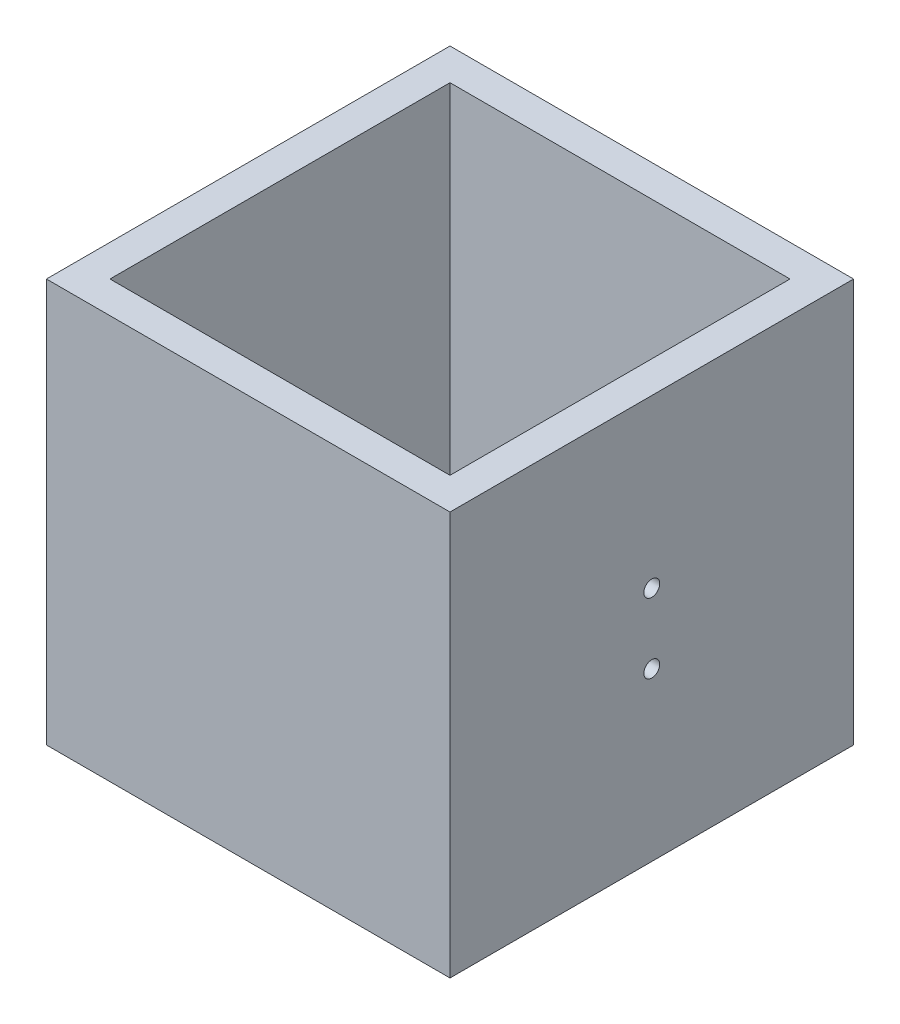
ISO-10303-21;
HEADER;
FILE_DESCRIPTION(('STEP AP214'),'2;1');
FILE_NAME('part.step','',(''),(''),'','','');
FILE_SCHEMA(('AUTOMOTIVE_DESIGN { 1 0 10303 214 1 1 1 1 }'));
ENDSEC;
DATA;
#1=APPLICATION_CONTEXT('core data for automotive mechanical design processes');
#2=APPLICATION_PROTOCOL_DEFINITION('international standard','automotive_design',2000,#1);
#3=PRODUCT_CONTEXT('',#1,'mechanical');
#4=PRODUCT('Part','Part','',(#3));
#5=PRODUCT_RELATED_PRODUCT_CATEGORY('part','',(#4));
#6=PRODUCT_DEFINITION_FORMATION('','',#4);
#7=PRODUCT_DEFINITION_CONTEXT('part definition',#1,'design');
#8=PRODUCT_DEFINITION('design','',#6,#7);
#9=PRODUCT_DEFINITION_SHAPE('','',#8);
#10=(LENGTH_UNIT() NAMED_UNIT(*) SI_UNIT(.MILLI.,.METRE.));
#11=(NAMED_UNIT(*) PLANE_ANGLE_UNIT() SI_UNIT($,.RADIAN.));
#12=(NAMED_UNIT(*) SI_UNIT($,.STERADIAN.) SOLID_ANGLE_UNIT());
#13=UNCERTAINTY_MEASURE_WITH_UNIT(LENGTH_MEASURE(1.E-05),#10,'distance_accuracy_value','');
#14=(GEOMETRIC_REPRESENTATION_CONTEXT(3) GLOBAL_UNCERTAINTY_ASSIGNED_CONTEXT((#13)) GLOBAL_UNIT_ASSIGNED_CONTEXT((#10,
#11,#12)) REPRESENTATION_CONTEXT('',''));
#15=CARTESIAN_POINT('',(0.,0.,0.));
#16=DIRECTION('',(0.,0.,1.));
#17=DIRECTION('',(1.,0.,0.));
#18=AXIS2_PLACEMENT_3D('',#15,#16,#17);
#19=CARTESIAN_POINT('',(-12.7,25.4,12.7));
#20=DIRECTION('',(1.,0.,0.));
#21=DIRECTION('',(0.,0.,-1.));
#22=AXIS2_PLACEMENT_3D('',#19,#20,#21);
#23=PLANE('',#22);
#24=DIRECTION('',(0.,0.,1.));
#25=VECTOR('',#24,1.);
#26=CARTESIAN_POINT('',(-12.7,0.,12.7));
#27=LINE('',#26,#25);
#28=CARTESIAN_POINT('',(-12.7,0.,-12.7));
#29=VERTEX_POINT('',#28);
#30=CARTESIAN_POINT('',(-12.7,0.,12.7));
#31=VERTEX_POINT('',#30);
#32=EDGE_CURVE('E206',#29,#31,#27,.T.);
#33=ORIENTED_EDGE('',*,*,#32,.T.);
#34=DIRECTION('',(0.,-1.,0.));
#35=VECTOR('',#34,1.);
#36=CARTESIAN_POINT('',(-12.7,25.4,12.7));
#37=LINE('',#36,#35);
#38=CARTESIAN_POINT('',(-12.7,25.4,12.7));
#39=VERTEX_POINT('',#38);
#40=EDGE_CURVE('E211',#39,#31,#37,.T.);
#41=ORIENTED_EDGE('',*,*,#40,.F.);
#42=DIRECTION('',(0.,0.,1.));
#43=VECTOR('',#42,1.);
#44=CARTESIAN_POINT('',(-12.7,25.4,12.7));
#45=LINE('',#44,#43);
#46=CARTESIAN_POINT('',(-12.7,25.4,-12.7));
#47=VERTEX_POINT('',#46);
#48=EDGE_CURVE('E197',#47,#39,#45,.T.);
#49=ORIENTED_EDGE('',*,*,#48,.F.);
#50=DIRECTION('',(0.,-1.,0.));
#51=VECTOR('',#50,1.);
#52=CARTESIAN_POINT('',(-12.7,25.4,-12.7));
#53=LINE('',#52,#51);
#54=EDGE_CURVE('E46',#47,#29,#53,.T.);
#55=ORIENTED_EDGE('',*,*,#54,.T.);
#56=EDGE_LOOP('',(#33,#41,#49,#55));
#57=FACE_BOUND('',#56,.T.);
#58=DIRECTION('',(0.,0.,1.));
#59=VECTOR('',#58,1.);
#60=CARTESIAN_POINT('',(-12.7,24.7,-12.));
#61=LINE('',#60,#59);
#62=CARTESIAN_POINT('',(-12.7,24.7,-12.));
#63=VERTEX_POINT('',#62);
#64=CARTESIAN_POINT('',(-12.7,24.7,12.));
#65=VERTEX_POINT('',#64);
#66=EDGE_CURVE('E54',#63,#65,#61,.T.);
#67=ORIENTED_EDGE('',*,*,#66,.T.);
#68=DIRECTION('',(0.,-1.,0.));
#69=VECTOR('',#68,1.);
#70=CARTESIAN_POINT('',(-12.7,24.7,12.));
#71=LINE('',#70,#69);
#72=CARTESIAN_POINT('',(-12.7,0.699999999999999,12.));
#73=VERTEX_POINT('',#72);
#74=EDGE_CURVE('E149',#65,#73,#71,.T.);
#75=ORIENTED_EDGE('',*,*,#74,.T.);
#76=DIRECTION('',(0.,0.,1.));
#77=VECTOR('',#76,1.);
#78=CARTESIAN_POINT('',(-12.7,0.699999999999999,-12.));
#79=LINE('',#78,#77);
#80=CARTESIAN_POINT('',(-12.7,0.699999999999999,-12.));
#81=VERTEX_POINT('',#80);
#82=EDGE_CURVE('E450',#81,#73,#79,.T.);
#83=ORIENTED_EDGE('',*,*,#82,.F.);
#84=DIRECTION('',(0.,-1.,0.));
#85=VECTOR('',#84,1.);
#86=CARTESIAN_POINT('',(-12.7,24.7,-12.));
#87=LINE('',#86,#85);
#88=EDGE_CURVE('E145',#63,#81,#87,.T.);
#89=ORIENTED_EDGE('',*,*,#88,.F.);
#90=EDGE_LOOP('',(#67,#75,#83,#89));
#91=FACE_BOUND('',#90,.T.);
#92=ADVANCED_FACE('F37',(#57,#91),#23,.F.);
#93=CARTESIAN_POINT('',(0.,25.4,0.));
#94=DIRECTION('',(0.,-1.,0.));
#95=DIRECTION('',(0.,0.,-1.));
#96=AXIS2_PLACEMENT_3D('',#93,#94,#95);
#97=PLANE('',#96);
#98=DIRECTION('',(0.,0.,-1.));
#99=VECTOR('',#98,1.);
#100=CARTESIAN_POINT('',(12.7,25.4,12.7));
#101=LINE('',#100,#99);
#102=CARTESIAN_POINT('',(12.7,25.4,12.7));
#103=VERTEX_POINT('',#102);
#104=CARTESIAN_POINT('',(12.7,25.4,-12.7));
#105=VERTEX_POINT('',#104);
#106=EDGE_CURVE('E191',#103,#105,#101,.T.);
#107=ORIENTED_EDGE('',*,*,#106,.T.);
#108=DIRECTION('',(-1.,0.,0.));
#109=VECTOR('',#108,1.);
#110=CARTESIAN_POINT('',(-12.7,25.4,-12.7));
#111=LINE('',#110,#109);
#112=EDGE_CURVE('E194',#105,#47,#111,.T.);
#113=ORIENTED_EDGE('',*,*,#112,.T.);
#114=ORIENTED_EDGE('',*,*,#48,.T.);
#115=DIRECTION('',(1.,0.,0.));
#116=VECTOR('',#115,1.);
#117=CARTESIAN_POINT('',(-12.7,25.4,12.7));
#118=LINE('',#117,#116);
#119=EDGE_CURVE('E199',#39,#103,#118,.T.);
#120=ORIENTED_EDGE('',*,*,#119,.T.);
#121=EDGE_LOOP('',(#107,#113,#114,#120));
#122=FACE_BOUND('',#121,.T.);
#123=DIRECTION('',(0.,0.,-1.));
#124=VECTOR('',#123,1.);
#125=CARTESIAN_POINT('',(10.7,25.4,0.));
#126=LINE('',#125,#124);
#127=CARTESIAN_POINT('',(10.7,25.4,10.7));
#128=VERTEX_POINT('',#127);
#129=CARTESIAN_POINT('',(10.7,25.4,-10.7));
#130=VERTEX_POINT('',#129);
#131=EDGE_CURVE('E184',#128,#130,#126,.T.);
#132=ORIENTED_EDGE('',*,*,#131,.F.);
#133=DIRECTION('',(1.,0.,0.));
#134=VECTOR('',#133,1.);
#135=CARTESIAN_POINT('',(0.,25.4,10.7));
#136=LINE('',#135,#134);
#137=CARTESIAN_POINT('',(-10.7,25.4,10.7));
#138=VERTEX_POINT('',#137);
#139=EDGE_CURVE('E175',#138,#128,#136,.T.);
#140=ORIENTED_EDGE('',*,*,#139,.F.);
#141=DIRECTION('',(0.,0.,1.));
#142=VECTOR('',#141,1.);
#143=CARTESIAN_POINT('',(-10.7,25.4,0.));
#144=LINE('',#143,#142);
#145=CARTESIAN_POINT('',(-10.7,25.4,-10.7));
#146=VERTEX_POINT('',#145);
#147=EDGE_CURVE('E188',#146,#138,#144,.T.);
#148=ORIENTED_EDGE('',*,*,#147,.F.);
#149=DIRECTION('',(-1.,0.,0.));
#150=VECTOR('',#149,1.);
#151=CARTESIAN_POINT('',(0.,25.4,-10.7));
#152=LINE('',#151,#150);
#153=EDGE_CURVE('E186',#130,#146,#152,.T.);
#154=ORIENTED_EDGE('',*,*,#153,.F.);
#155=EDGE_LOOP('',(#132,#140,#148,#154));
#156=FACE_BOUND('',#155,.T.);
#157=ADVANCED_FACE('F239',(#122,#156),#97,.F.);
#158=CARTESIAN_POINT('',(12.7,25.4,12.7));
#159=DIRECTION('',(-1.,0.,0.));
#160=DIRECTION('',(0.,0.,1.));
#161=AXIS2_PLACEMENT_3D('',#158,#159,#160);
#162=PLANE('',#161);
#163=CARTESIAN_POINT('',(12.7,14.9,0.));
#164=DIRECTION('',(1.,0.,0.));
#165=DIRECTION('',(0.,0.,-1.));
#166=AXIS2_PLACEMENT_3D('',#163,#164,#165);
#167=CIRCLE('',#166,0.5);
#168=CARTESIAN_POINT('',(12.7,14.9,-0.5));
#169=VERTEX_POINT('',#168);
#170=EDGE_CURVE('E150',#169,#169,#167,.T.);
#171=ORIENTED_EDGE('',*,*,#170,.F.);
#172=EDGE_LOOP('',(#171));
#173=FACE_BOUND('',#172,.T.);
#174=CARTESIAN_POINT('',(12.7,10.5,0.));
#175=DIRECTION('',(1.,0.,0.));
#176=DIRECTION('',(0.,0.,-1.));
#177=AXIS2_PLACEMENT_3D('',#174,#175,#176);
#178=CIRCLE('',#177,0.5);
#179=CARTESIAN_POINT('',(12.7,10.5,-0.5));
#180=VERTEX_POINT('',#179);
#181=EDGE_CURVE('E159',#180,#180,#178,.T.);
#182=ORIENTED_EDGE('',*,*,#181,.F.);
#183=EDGE_LOOP('',(#182));
#184=FACE_BOUND('',#183,.T.);
#185=DIRECTION('',(0.,0.,-1.));
#186=VECTOR('',#185,1.);
#187=CARTESIAN_POINT('',(12.7,0.,12.7));
#188=LINE('',#187,#186);
#189=CARTESIAN_POINT('',(12.7,0.,12.7));
#190=VERTEX_POINT('',#189);
#191=CARTESIAN_POINT('',(12.7,0.,-12.7));
#192=VERTEX_POINT('',#191);
#193=EDGE_CURVE('E170',#190,#192,#188,.T.);
#194=ORIENTED_EDGE('',*,*,#193,.T.);
#195=DIRECTION('',(0.,-1.,0.));
#196=VECTOR('',#195,1.);
#197=CARTESIAN_POINT('',(12.7,25.4,-12.7));
#198=LINE('',#197,#196);
#199=EDGE_CURVE('E11',#105,#192,#198,.T.);
#200=ORIENTED_EDGE('',*,*,#199,.F.);
#201=ORIENTED_EDGE('',*,*,#106,.F.);
#202=DIRECTION('',(0.,-1.,0.));
#203=VECTOR('',#202,1.);
#204=CARTESIAN_POINT('',(12.7,25.4,12.7));
#205=LINE('',#204,#203);
#206=EDGE_CURVE('E201',#103,#190,#205,.T.);
#207=ORIENTED_EDGE('',*,*,#206,.T.);
#208=EDGE_LOOP('',(#194,#200,#201,#207));
#209=FACE_BOUND('',#208,.T.);
#210=ADVANCED_FACE('F39',(#173,#184,#209),#162,.F.);
#211=CARTESIAN_POINT('',(-12.7,25.4,-12.7));
#212=DIRECTION('',(0.,0.,1.));
#213=DIRECTION('',(1.,0.,0.));
#214=AXIS2_PLACEMENT_3D('',#211,#212,#213);
#215=PLANE('',#214);
#216=DIRECTION('',(-1.,0.,0.));
#217=VECTOR('',#216,1.);
#218=CARTESIAN_POINT('',(-12.7,0.,-12.7));
#219=LINE('',#218,#217);
#220=EDGE_CURVE('E204',#192,#29,#219,.T.);
#221=ORIENTED_EDGE('',*,*,#220,.T.);
#222=ORIENTED_EDGE('',*,*,#54,.F.);
#223=ORIENTED_EDGE('',*,*,#112,.F.);
#224=ORIENTED_EDGE('',*,*,#199,.T.);
#225=EDGE_LOOP('',(#221,#222,#223,#224));
#226=FACE_BOUND('',#225,.T.);
#227=ADVANCED_FACE('F265',(#226),#215,.F.);
#228=CARTESIAN_POINT('',(-12.7,25.4,12.7));
#229=DIRECTION('',(0.,0.,-1.));
#230=DIRECTION('',(-1.,0.,0.));
#231=AXIS2_PLACEMENT_3D('',#228,#229,#230);
#232=PLANE('',#231);
#233=DIRECTION('',(1.,0.,0.));
#234=VECTOR('',#233,1.);
#235=CARTESIAN_POINT('',(-12.7,0.,12.7));
#236=LINE('',#235,#234);
#237=EDGE_CURVE('E195',#31,#190,#236,.T.);
#238=ORIENTED_EDGE('',*,*,#237,.T.);
#239=ORIENTED_EDGE('',*,*,#206,.F.);
#240=ORIENTED_EDGE('',*,*,#119,.F.);
#241=ORIENTED_EDGE('',*,*,#40,.T.);
#242=EDGE_LOOP('',(#238,#239,#240,#241));
#243=FACE_BOUND('',#242,.T.);
#244=ADVANCED_FACE('F263',(#243),#232,.F.);
#245=CARTESIAN_POINT('',(0.,0.,0.));
#246=DIRECTION('',(0.,-1.,0.));
#247=DIRECTION('',(0.,0.,-1.));
#248=AXIS2_PLACEMENT_3D('',#245,#246,#247);
#249=PLANE('',#248);
#250=ORIENTED_EDGE('',*,*,#193,.F.);
#251=ORIENTED_EDGE('',*,*,#237,.F.);
#252=ORIENTED_EDGE('',*,*,#32,.F.);
#253=ORIENTED_EDGE('',*,*,#220,.F.);
#254=EDGE_LOOP('',(#250,#251,#252,#253));
#255=FACE_BOUND('',#254,.T.);
#256=ADVANCED_FACE('F225',(#255),#249,.T.);
#257=CARTESIAN_POINT('',(10.7,25.4,12.7));
#258=DIRECTION('',(-1.,0.,0.));
#259=DIRECTION('',(0.,0.,1.));
#260=AXIS2_PLACEMENT_3D('',#257,#258,#259);
#261=PLANE('',#260);
#262=CARTESIAN_POINT('',(10.7,14.9,0.));
#263=DIRECTION('',(-1.,0.,0.));
#264=DIRECTION('',(0.,0.,1.));
#265=AXIS2_PLACEMENT_3D('',#262,#263,#264);
#266=CIRCLE('',#265,0.5);
#267=CARTESIAN_POINT('',(10.7,14.9,0.5));
#268=VERTEX_POINT('',#267);
#269=EDGE_CURVE('E41',#268,#268,#266,.T.);
#270=ORIENTED_EDGE('',*,*,#269,.F.);
#271=EDGE_LOOP('',(#270));
#272=FACE_BOUND('',#271,.T.);
#273=CARTESIAN_POINT('',(10.7,10.5,0.));
#274=DIRECTION('',(-1.,0.,0.));
#275=DIRECTION('',(0.,0.,1.));
#276=AXIS2_PLACEMENT_3D('',#273,#274,#275);
#277=CIRCLE('',#276,0.5);
#278=CARTESIAN_POINT('',(10.7,10.5,0.5));
#279=VERTEX_POINT('',#278);
#280=EDGE_CURVE('E162',#279,#279,#277,.T.);
#281=ORIENTED_EDGE('',*,*,#280,.F.);
#282=EDGE_LOOP('',(#281));
#283=FACE_BOUND('',#282,.T.);
#284=DIRECTION('',(0.,0.,-1.));
#285=VECTOR('',#284,1.);
#286=CARTESIAN_POINT('',(10.7,2.,0.));
#287=LINE('',#286,#285);
#288=CARTESIAN_POINT('',(10.7,2.,10.7));
#289=VERTEX_POINT('',#288);
#290=CARTESIAN_POINT('',(10.7,2.,-10.7));
#291=VERTEX_POINT('',#290);
#292=EDGE_CURVE('E163',#289,#291,#287,.T.);
#293=ORIENTED_EDGE('',*,*,#292,.F.);
#294=DIRECTION('',(0.,-1.,0.));
#295=VECTOR('',#294,1.);
#296=CARTESIAN_POINT('',(10.7,25.4,10.7));
#297=LINE('',#296,#295);
#298=EDGE_CURVE('E172',#128,#289,#297,.T.);
#299=ORIENTED_EDGE('',*,*,#298,.F.);
#300=ORIENTED_EDGE('',*,*,#131,.T.);
#301=DIRECTION('',(0.,-1.,0.));
#302=VECTOR('',#301,1.);
#303=CARTESIAN_POINT('',(10.7,25.4,-10.7));
#304=LINE('',#303,#302);
#305=EDGE_CURVE('E167',#130,#291,#304,.T.);
#306=ORIENTED_EDGE('',*,*,#305,.T.);
#307=EDGE_LOOP('',(#293,#299,#300,#306));
#308=FACE_BOUND('',#307,.T.);
#309=ADVANCED_FACE('F221',(#272,#283,#308),#261,.T.);
#310=CARTESIAN_POINT('',(-12.7,25.4,-10.7));
#311=DIRECTION('',(0.,0.,1.));
#312=DIRECTION('',(1.,0.,0.));
#313=AXIS2_PLACEMENT_3D('',#310,#311,#312);
#314=PLANE('',#313);
#315=DIRECTION('',(-1.,0.,0.));
#316=VECTOR('',#315,1.);
#317=CARTESIAN_POINT('',(0.,2.,-10.7));
#318=LINE('',#317,#316);
#319=CARTESIAN_POINT('',(-10.7,2.,-10.7));
#320=VERTEX_POINT('',#319);
#321=EDGE_CURVE('E166',#291,#320,#318,.T.);
#322=ORIENTED_EDGE('',*,*,#321,.F.);
#323=ORIENTED_EDGE('',*,*,#305,.F.);
#324=ORIENTED_EDGE('',*,*,#153,.T.);
#325=DIRECTION('',(0.,-1.,0.));
#326=VECTOR('',#325,1.);
#327=CARTESIAN_POINT('',(-10.7,25.4,-10.7));
#328=LINE('',#327,#326);
#329=EDGE_CURVE('E171',#146,#320,#328,.T.);
#330=ORIENTED_EDGE('',*,*,#329,.T.);
#331=EDGE_LOOP('',(#322,#323,#324,#330));
#332=FACE_BOUND('',#331,.T.);
#333=ADVANCED_FACE('F224',(#332),#314,.T.);
#334=CARTESIAN_POINT('',(-10.7,25.4,12.7));
#335=DIRECTION('',(1.,0.,0.));
#336=DIRECTION('',(0.,0.,-1.));
#337=AXIS2_PLACEMENT_3D('',#334,#335,#336);
#338=PLANE('',#337);
#339=DIRECTION('',(0.,0.,1.));
#340=VECTOR('',#339,1.);
#341=CARTESIAN_POINT('',(-10.7,2.,0.));
#342=LINE('',#341,#340);
#343=CARTESIAN_POINT('',(-10.7,2.,10.7));
#344=VERTEX_POINT('',#343);
#345=EDGE_CURVE('E177',#320,#344,#342,.T.);
#346=ORIENTED_EDGE('',*,*,#345,.F.);
#347=ORIENTED_EDGE('',*,*,#329,.F.);
#348=ORIENTED_EDGE('',*,*,#147,.T.);
#349=DIRECTION('',(0.,-1.,0.));
#350=VECTOR('',#349,1.);
#351=CARTESIAN_POINT('',(-10.7,25.4,10.7));
#352=LINE('',#351,#350);
#353=EDGE_CURVE('E62',#138,#344,#352,.T.);
#354=ORIENTED_EDGE('',*,*,#353,.T.);
#355=EDGE_LOOP('',(#346,#347,#348,#354));
#356=FACE_BOUND('',#355,.T.);
#357=ADVANCED_FACE('F244',(#356),#338,.T.);
#358=CARTESIAN_POINT('',(-12.7,25.4,10.7));
#359=DIRECTION('',(0.,0.,-1.));
#360=DIRECTION('',(-1.,0.,0.));
#361=AXIS2_PLACEMENT_3D('',#358,#359,#360);
#362=PLANE('',#361);
#363=DIRECTION('',(1.,0.,0.));
#364=VECTOR('',#363,1.);
#365=CARTESIAN_POINT('',(0.,2.,10.7));
#366=LINE('',#365,#364);
#367=EDGE_CURVE('E181',#344,#289,#366,.T.);
#368=ORIENTED_EDGE('',*,*,#367,.F.);
#369=ORIENTED_EDGE('',*,*,#353,.F.);
#370=ORIENTED_EDGE('',*,*,#139,.T.);
#371=ORIENTED_EDGE('',*,*,#298,.T.);
#372=EDGE_LOOP('',(#368,#369,#370,#371));
#373=FACE_BOUND('',#372,.T.);
#374=ADVANCED_FACE('F235',(#373),#362,.T.);
#375=CARTESIAN_POINT('',(0.,2.,0.));
#376=DIRECTION('',(0.,-1.,0.));
#377=DIRECTION('',(0.,0.,-1.));
#378=AXIS2_PLACEMENT_3D('',#375,#376,#377);
#379=PLANE('',#378);
#380=ORIENTED_EDGE('',*,*,#292,.T.);
#381=ORIENTED_EDGE('',*,*,#321,.T.);
#382=ORIENTED_EDGE('',*,*,#345,.T.);
#383=ORIENTED_EDGE('',*,*,#367,.T.);
#384=EDGE_LOOP('',(#380,#381,#382,#383));
#385=FACE_BOUND('',#384,.T.);
#386=ADVANCED_FACE('F233',(#385),#379,.F.);
#387=CARTESIAN_POINT('',(6.30000000000001,10.5,0.));
#388=DIRECTION('',(1.,0.,0.));
#389=DIRECTION('',(0.,0.,-1.));
#390=AXIS2_PLACEMENT_3D('',#387,#388,#389);
#391=CYLINDRICAL_SURFACE('',#390,0.5);
#392=ORIENTED_EDGE('',*,*,#280,.T.);
#393=EDGE_LOOP('',(#392));
#394=FACE_BOUND('',#393,.T.);
#395=ORIENTED_EDGE('',*,*,#181,.T.);
#396=EDGE_LOOP('',(#395));
#397=FACE_BOUND('',#396,.T.);
#398=ADVANCED_FACE('F218',(#394,#397),#391,.F.);
#399=CARTESIAN_POINT('',(6.30000000000001,14.9,0.));
#400=DIRECTION('',(1.,0.,0.));
#401=DIRECTION('',(0.,0.,-1.));
#402=AXIS2_PLACEMENT_3D('',#399,#400,#401);
#403=CYLINDRICAL_SURFACE('',#402,0.5);
#404=ORIENTED_EDGE('',*,*,#269,.T.);
#405=EDGE_LOOP('',(#404));
#406=FACE_BOUND('',#405,.T.);
#407=ORIENTED_EDGE('',*,*,#170,.T.);
#408=EDGE_LOOP('',(#407));
#409=FACE_BOUND('',#408,.T.);
#410=ADVANCED_FACE('F294',(#406,#409),#403,.F.);
#411=CARTESIAN_POINT('',(-11.2,24.7,-12.));
#412=DIRECTION('',(0.,-1.,0.));
#413=DIRECTION('',(0.,0.,-1.));
#414=AXIS2_PLACEMENT_3D('',#411,#412,#413);
#415=PLANE('',#414);
#416=ORIENTED_EDGE('',*,*,#66,.F.);
#417=DIRECTION('',(-1.,0.,0.));
#418=VECTOR('',#417,1.);
#419=CARTESIAN_POINT('',(-11.2,24.7,-12.));
#420=LINE('',#419,#418);
#421=CARTESIAN_POINT('',(-11.2,24.7,-12.));
#422=VERTEX_POINT('',#421);
#423=EDGE_CURVE('E144',#422,#63,#420,.T.);
#424=ORIENTED_EDGE('',*,*,#423,.F.);
#425=DIRECTION('',(0.,0.,1.));
#426=VECTOR('',#425,1.);
#427=CARTESIAN_POINT('',(-11.2,24.7,-12.));
#428=LINE('',#427,#426);
#429=CARTESIAN_POINT('',(-11.2,24.7,12.));
#430=VERTEX_POINT('',#429);
#431=EDGE_CURVE('E134',#422,#430,#428,.T.);
#432=ORIENTED_EDGE('',*,*,#431,.T.);
#433=DIRECTION('',(-1.,0.,0.));
#434=VECTOR('',#433,1.);
#435=CARTESIAN_POINT('',(-11.2,24.7,12.));
#436=LINE('',#435,#434);
#437=EDGE_CURVE('E143',#430,#65,#436,.T.);
#438=ORIENTED_EDGE('',*,*,#437,.T.);
#439=EDGE_LOOP('',(#416,#424,#432,#438));
#440=FACE_BOUND('',#439,.T.);
#441=ADVANCED_FACE('F142',(#440),#415,.T.);
#442=CARTESIAN_POINT('',(-11.2,24.7,12.));
#443=DIRECTION('',(0.,0.,-1.));
#444=DIRECTION('',(0.,1.,0.));
#445=AXIS2_PLACEMENT_3D('',#442,#443,#444);
#446=PLANE('',#445);
#447=ORIENTED_EDGE('',*,*,#74,.F.);
#448=ORIENTED_EDGE('',*,*,#437,.F.);
#449=DIRECTION('',(0.,-1.,0.));
#450=VECTOR('',#449,1.);
#451=CARTESIAN_POINT('',(-11.2,24.7,12.));
#452=LINE('',#451,#450);
#453=CARTESIAN_POINT('',(-11.2,0.699999999999999,12.));
#454=VERTEX_POINT('',#453);
#455=EDGE_CURVE('E130',#430,#454,#452,.T.);
#456=ORIENTED_EDGE('',*,*,#455,.T.);
#457=DIRECTION('',(-1.,0.,0.));
#458=VECTOR('',#457,1.);
#459=CARTESIAN_POINT('',(-11.2,0.699999999999999,12.));
#460=LINE('',#459,#458);
#461=EDGE_CURVE('E151',#454,#73,#460,.T.);
#462=ORIENTED_EDGE('',*,*,#461,.T.);
#463=EDGE_LOOP('',(#447,#448,#456,#462));
#464=FACE_BOUND('',#463,.T.);
#465=ADVANCED_FACE('F147',(#464),#446,.T.);
#466=CARTESIAN_POINT('',(-11.2,0.699999999999999,-12.));
#467=DIRECTION('',(0.,-1.,0.));
#468=DIRECTION('',(0.,0.,-1.));
#469=AXIS2_PLACEMENT_3D('',#466,#467,#468);
#470=PLANE('',#469);
#471=ORIENTED_EDGE('',*,*,#82,.T.);
#472=ORIENTED_EDGE('',*,*,#461,.F.);
#473=DIRECTION('',(0.,0.,1.));
#474=VECTOR('',#473,1.);
#475=CARTESIAN_POINT('',(-11.2,0.699999999999999,-12.));
#476=LINE('',#475,#474);
#477=CARTESIAN_POINT('',(-11.2,0.699999999999999,-12.));
#478=VERTEX_POINT('',#477);
#479=EDGE_CURVE('E137',#478,#454,#476,.T.);
#480=ORIENTED_EDGE('',*,*,#479,.F.);
#481=DIRECTION('',(-1.,0.,0.));
#482=VECTOR('',#481,1.);
#483=CARTESIAN_POINT('',(-11.2,0.699999999999999,-12.));
#484=LINE('',#483,#482);
#485=EDGE_CURVE('E155',#478,#81,#484,.T.);
#486=ORIENTED_EDGE('',*,*,#485,.T.);
#487=EDGE_LOOP('',(#471,#472,#480,#486));
#488=FACE_BOUND('',#487,.T.);
#489=ADVANCED_FACE('F306',(#488),#470,.F.);
#490=CARTESIAN_POINT('',(-11.2,24.7,-12.));
#491=DIRECTION('',(0.,0.,-1.));
#492=DIRECTION('',(0.,1.,0.));
#493=AXIS2_PLACEMENT_3D('',#490,#491,#492);
#494=PLANE('',#493);
#495=ORIENTED_EDGE('',*,*,#88,.T.);
#496=ORIENTED_EDGE('',*,*,#485,.F.);
#497=DIRECTION('',(0.,-1.,0.));
#498=VECTOR('',#497,1.);
#499=CARTESIAN_POINT('',(-11.2,24.7,-12.));
#500=LINE('',#499,#498);
#501=EDGE_CURVE('E457',#422,#478,#500,.T.);
#502=ORIENTED_EDGE('',*,*,#501,.F.);
#503=ORIENTED_EDGE('',*,*,#423,.T.);
#504=EDGE_LOOP('',(#495,#496,#502,#503));
#505=FACE_BOUND('',#504,.T.);
#506=ADVANCED_FACE('F309',(#505),#494,.F.);
#507=CARTESIAN_POINT('',(-11.2,0.,0.));
#508=DIRECTION('',(1.,0.,0.));
#509=DIRECTION('',(0.,0.,-1.));
#510=AXIS2_PLACEMENT_3D('',#507,#508,#509);
#511=PLANE('',#510);
#512=ORIENTED_EDGE('',*,*,#431,.F.);
#513=ORIENTED_EDGE('',*,*,#501,.T.);
#514=ORIENTED_EDGE('',*,*,#479,.T.);
#515=ORIENTED_EDGE('',*,*,#455,.F.);
#516=EDGE_LOOP('',(#512,#513,#514,#515));
#517=FACE_BOUND('',#516,.T.);
#518=ADVANCED_FACE('F132',(#517),#511,.F.);
#519=CLOSED_SHELL('',(#92,#157,#210,#227,#244,#256,#309,#333,#357,#374,#386,#398,#410,#441,#465,
#489,#506,#518));
#520=MANIFOLD_SOLID_BREP('B2',#519);
#521=ADVANCED_BREP_SHAPE_REPRESENTATION('',(#18,#520),#14);
#522=SHAPE_DEFINITION_REPRESENTATION(#9,#521);
ENDSEC;
END-ISO-10303-21;
